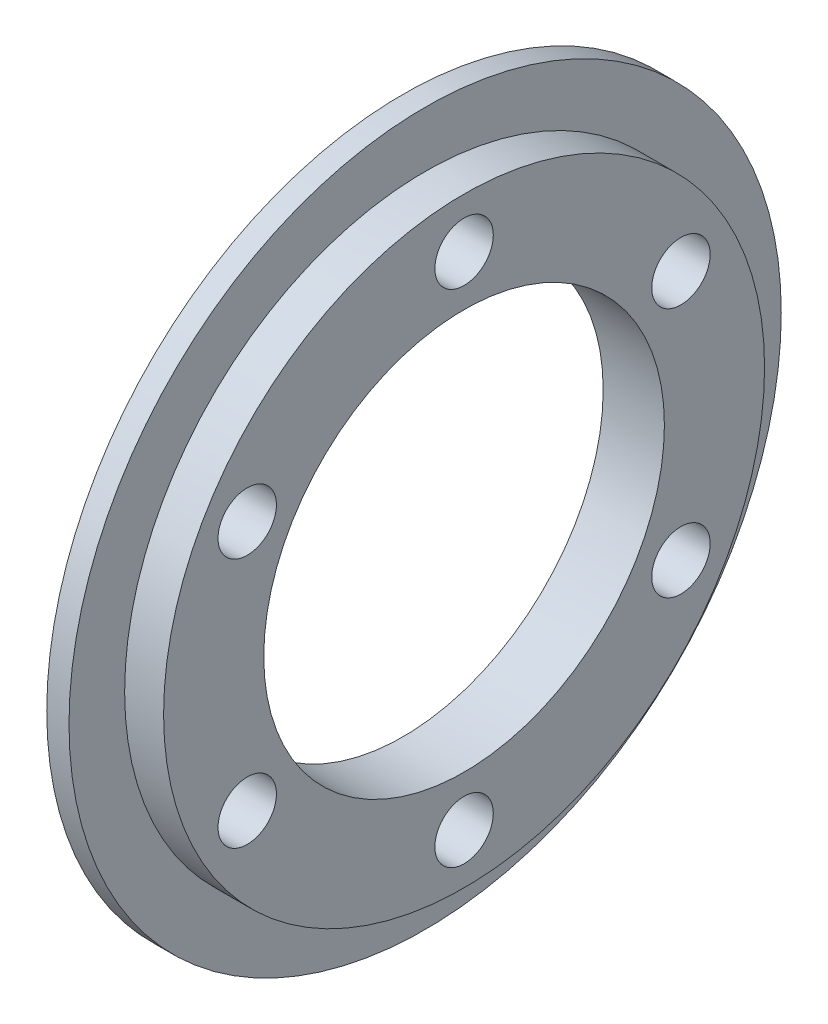
ISO-10303-21;
HEADER;
FILE_DESCRIPTION(('STEP AP214'),'2;1');
FILE_NAME('part.step','',(''),(''),'','','');
FILE_SCHEMA(('AUTOMOTIVE_DESIGN { 1 0 10303 214 1 1 1 1 }'));
ENDSEC;
DATA;
#1=APPLICATION_CONTEXT('core data for automotive mechanical design processes');
#2=APPLICATION_PROTOCOL_DEFINITION('international standard','automotive_design',2000,#1);
#3=PRODUCT_CONTEXT('',#1,'mechanical');
#4=PRODUCT('Part','Part','',(#3));
#5=PRODUCT_RELATED_PRODUCT_CATEGORY('part','',(#4));
#6=PRODUCT_DEFINITION_FORMATION('','',#4);
#7=PRODUCT_DEFINITION_CONTEXT('part definition',#1,'design');
#8=PRODUCT_DEFINITION('design','',#6,#7);
#9=PRODUCT_DEFINITION_SHAPE('','',#8);
#10=(LENGTH_UNIT() NAMED_UNIT(*) SI_UNIT(.MILLI.,.METRE.));
#11=(NAMED_UNIT(*) PLANE_ANGLE_UNIT() SI_UNIT($,.RADIAN.));
#12=(NAMED_UNIT(*) SI_UNIT($,.STERADIAN.) SOLID_ANGLE_UNIT());
#13=UNCERTAINTY_MEASURE_WITH_UNIT(LENGTH_MEASURE(1.E-05),#10,'distance_accuracy_value','');
#14=(GEOMETRIC_REPRESENTATION_CONTEXT(3) GLOBAL_UNCERTAINTY_ASSIGNED_CONTEXT((#13)) GLOBAL_UNIT_ASSIGNED_CONTEXT((#10,
#11,#12)) REPRESENTATION_CONTEXT('',''));
#15=CARTESIAN_POINT('',(0.,0.,0.));
#16=DIRECTION('',(0.,0.,1.));
#17=DIRECTION('',(1.,0.,0.));
#18=AXIS2_PLACEMENT_3D('',#15,#16,#17);
#19=CARTESIAN_POINT('',(-0.499999999999622,0.,-3.70187199858681E-12));
#20=DIRECTION('',(-1.,0.,-2.1153554277646E-13));
#21=DIRECTION('',(-2.1153554277646E-13,0.,1.));
#22=AXIS2_PLACEMENT_3D('',#19,#20,#21);
#23=CYLINDRICAL_SURFACE('',#22,35.999999999997);
#24=CARTESIAN_POINT('',(10.9999999999924,0.,-1.2692132566592E-12));
#25=DIRECTION('',(-1.,0.,-2.1153554277646E-13));
#26=DIRECTION('',(-2.1153554277646E-13,0.,1.));
#27=AXIS2_PLACEMENT_3D('',#24,#25,#26);
#28=CIRCLE('',#27,35.9999999999981);
#29=CARTESIAN_POINT('',(10.9999999999848,0.,35.9999999999969));
#30=VERTEX_POINT('',#29);
#31=EDGE_CURVE('E10',#30,#30,#28,.T.);
#32=ORIENTED_EDGE('',*,*,#31,.F.);
#33=EDGE_LOOP('',(#32));
#34=FACE_BOUND('',#33,.T.);
#35=CARTESIAN_POINT('',(-7.61185819236898E-12,0.,-3.59610422720027E-12));
#36=DIRECTION('',(-1.,0.,-2.1153554277646E-13));
#37=DIRECTION('',(-2.1153554277646E-13,0.,1.));
#38=AXIS2_PLACEMENT_3D('',#35,#36,#37);
#39=CIRCLE('',#38,35.9999999999958);
#40=CARTESIAN_POINT('',(-1.52271377323207E-11,0.,35.9999999999922));
#41=VERTEX_POINT('',#40);
#42=EDGE_CURVE('E61',#41,#41,#39,.T.);
#43=ORIENTED_EDGE('',*,*,#42,.T.);
#44=EDGE_LOOP('',(#43));
#45=FACE_BOUND('',#44,.T.);
#46=ADVANCED_FACE('F39',(#34,#45),#23,.F.);
#47=CARTESIAN_POINT('',(10.9999999999981,0.,-35.9999999999994));
#48=DIRECTION('',(-1.,0.,-2.1153554277646E-13));
#49=DIRECTION('',(-2.1153554277646E-13,0.,1.));
#50=AXIS2_PLACEMENT_3D('',#47,#48,#49);
#51=PLANE('',#50);
#52=CARTESIAN_POINT('',(10.9999999999905,45.0000000000002,2.32689097053905E-12));
#53=DIRECTION('',(1.,0.,1.34460344093496E-13));
#54=DIRECTION('',(1.34460344093496E-13,0.,-1.));
#55=AXIS2_PLACEMENT_3D('',#52,#53,#54);
#56=CIRCLE('',#55,5.25);
#57=CARTESIAN_POINT('',(10.9999999999912,45.0000000000002,-5.24999999999767));
#58=VERTEX_POINT('',#57);
#59=EDGE_CURVE('E97',#58,#58,#56,.T.);
#60=ORIENTED_EDGE('',*,*,#59,.F.);
#61=EDGE_LOOP('',(#60));
#62=FACE_BOUND('',#61,.T.);
#63=CARTESIAN_POINT('',(10.9999999999957,22.4999999999926,-38.9711431702931));
#64=DIRECTION('',(1.,0.,1.34460344093496E-13));
#65=DIRECTION('',(1.34460344093496E-13,0.,-1.));
#66=AXIS2_PLACEMENT_3D('',#63,#64,#65);
#67=CIRCLE('',#66,5.25);
#68=CARTESIAN_POINT('',(10.9999999999964,22.4999999999926,-44.2211431702931));
#69=VERTEX_POINT('',#68);
#70=EDGE_CURVE('E91',#69,#69,#67,.T.);
#71=ORIENTED_EDGE('',*,*,#70,.F.);
#72=EDGE_LOOP('',(#71));
#73=FACE_BOUND('',#72,.T.);
#74=CARTESIAN_POINT('',(10.9999999999957,-22.5000000000076,-38.9711431702844));
#75=DIRECTION('',(1.,0.,1.34460344093496E-13));
#76=DIRECTION('',(1.34460344093496E-13,0.,-1.));
#77=AXIS2_PLACEMENT_3D('',#74,#75,#76);
#78=CIRCLE('',#77,5.25);
#79=CARTESIAN_POINT('',(10.9999999999964,-22.5000000000076,-44.2211431702844));
#80=VERTEX_POINT('',#79);
#81=EDGE_CURVE('E85',#80,#80,#78,.T.);
#82=ORIENTED_EDGE('',*,*,#81,.F.);
#83=EDGE_LOOP('',(#82));
#84=FACE_BOUND('',#83,.T.);
#85=CARTESIAN_POINT('',(10.9999999999905,-45.,1.98832304406973E-11));
#86=DIRECTION('',(1.,0.,1.34460344093496E-13));
#87=DIRECTION('',(1.34460344093496E-13,0.,-1.));
#88=AXIS2_PLACEMENT_3D('',#85,#86,#87);
#89=CIRCLE('',#88,5.25);
#90=CARTESIAN_POINT('',(10.9999999999912,-45.,-5.24999999998011));
#91=VERTEX_POINT('',#90);
#92=EDGE_CURVE('E79',#91,#91,#89,.T.);
#93=ORIENTED_EDGE('',*,*,#92,.F.);
#94=EDGE_LOOP('',(#93));
#95=FACE_BOUND('',#94,.T.);
#96=CARTESIAN_POINT('',(10.9999999999852,-22.4999999999924,38.9711431703153));
#97=DIRECTION('',(1.,0.,1.34460344093496E-13));
#98=DIRECTION('',(1.34460344093496E-13,0.,-1.));
#99=AXIS2_PLACEMENT_3D('',#96,#97,#98);
#100=CIRCLE('',#99,5.25);
#101=CARTESIAN_POINT('',(10.9999999999859,-22.4999999999924,33.7211431703153));
#102=VERTEX_POINT('',#101);
#103=EDGE_CURVE('E73',#102,#102,#100,.T.);
#104=ORIENTED_EDGE('',*,*,#103,.F.);
#105=EDGE_LOOP('',(#104));
#106=FACE_BOUND('',#105,.T.);
#107=CARTESIAN_POINT('',(10.9999999999852,22.5000000000078,38.9711431703066));
#108=DIRECTION('',(1.,0.,1.34460344093496E-13));
#109=DIRECTION('',(1.34460344093496E-13,0.,-1.));
#110=AXIS2_PLACEMENT_3D('',#107,#108,#109);
#111=CIRCLE('',#110,5.25);
#112=CARTESIAN_POINT('',(10.9999999999859,22.5000000000078,33.7211431703066));
#113=VERTEX_POINT('',#112);
#114=EDGE_CURVE('E67',#113,#113,#111,.T.);
#115=ORIENTED_EDGE('',*,*,#114,.F.);
#116=EDGE_LOOP('',(#115));
#117=FACE_BOUND('',#116,.T.);
#118=CARTESIAN_POINT('',(10.9999999999886,0.,-1.26921325666001E-12));
#119=DIRECTION('',(-1.,0.,-2.1153554277646E-13));
#120=DIRECTION('',(-2.1153554277646E-13,0.,1.));
#121=AXIS2_PLACEMENT_3D('',#118,#119,#120);
#122=CIRCLE('',#121,53.9999999999981);
#123=CARTESIAN_POINT('',(10.9999999999772,0.,53.9999999999969));
#124=VERTEX_POINT('',#123);
#125=EDGE_CURVE('E45',#124,#124,#122,.T.);
#126=ORIENTED_EDGE('',*,*,#125,.F.);
#127=EDGE_LOOP('',(#126));
#128=FACE_BOUND('',#127,.T.);
#129=ORIENTED_EDGE('',*,*,#31,.T.);
#130=EDGE_LOOP('',(#129));
#131=FACE_BOUND('',#130,.T.);
#132=ADVANCED_FACE('F103',(#62,#73,#84,#95,#106,#117,#128,#131),#51,.F.);
#133=CARTESIAN_POINT('',(-0.499999999999622,0.,-3.70187199858681E-12));
#134=DIRECTION('',(-1.,0.,-2.1153554277646E-13));
#135=DIRECTION('',(-2.1153554277646E-13,0.,1.));
#136=AXIS2_PLACEMENT_3D('',#133,#134,#135);
#137=CYLINDRICAL_SURFACE('',#136,53.9999999999974);
#138=CARTESIAN_POINT('',(3.99999999998858,0.,-2.74996205609523E-12));
#139=DIRECTION('',(-1.,0.,-2.1153554277646E-13));
#140=DIRECTION('',(-2.1153554277646E-13,0.,1.));
#141=AXIS2_PLACEMENT_3D('',#138,#139,#140);
#142=CIRCLE('',#141,53.9999999999966);
#143=CARTESIAN_POINT('',(3.99999999997716,0.,53.9999999999939));
#144=VERTEX_POINT('',#143);
#145=EDGE_CURVE('E49',#144,#144,#142,.T.);
#146=ORIENTED_EDGE('',*,*,#145,.F.);
#147=EDGE_LOOP('',(#146));
#148=FACE_BOUND('',#147,.T.);
#149=ORIENTED_EDGE('',*,*,#125,.T.);
#150=EDGE_LOOP('',(#149));
#151=FACE_BOUND('',#150,.T.);
#152=ADVANCED_FACE('F106',(#148,#151),#137,.T.);
#153=CARTESIAN_POINT('',(3.99999999999894,0.,-53.9999999999994));
#154=DIRECTION('',(-1.,0.,-2.1153554277646E-13));
#155=DIRECTION('',(-2.1153554277646E-13,0.,1.));
#156=AXIS2_PLACEMENT_3D('',#153,#154,#155);
#157=PLANE('',#156);
#158=CARTESIAN_POINT('',(3.99999999998646,0.,-2.74996205609568E-12));
#159=DIRECTION('',(-1.,0.,-2.1153554277646E-13));
#160=DIRECTION('',(-2.1153554277646E-13,0.,1.));
#161=AXIS2_PLACEMENT_3D('',#158,#159,#160);
#162=CIRCLE('',#161,63.9999999999966);
#163=CARTESIAN_POINT('',(3.99999999997292,0.,63.9999999999939));
#164=VERTEX_POINT('',#163);
#165=EDGE_CURVE('E53',#164,#164,#162,.T.);
#166=ORIENTED_EDGE('',*,*,#165,.F.);
#167=EDGE_LOOP('',(#166));
#168=FACE_BOUND('',#167,.T.);
#169=ORIENTED_EDGE('',*,*,#145,.T.);
#170=EDGE_LOOP('',(#169));
#171=FACE_BOUND('',#170,.T.);
#172=ADVANCED_FACE('F148',(#168,#171),#157,.F.);
#173=CARTESIAN_POINT('',(-0.499999999999622,0.,-3.70187199858681E-12));
#174=DIRECTION('',(-1.,0.,-2.1153554277646E-13));
#175=DIRECTION('',(-2.1153554277646E-13,0.,1.));
#176=AXIS2_PLACEMENT_3D('',#173,#174,#175);
#177=CYLINDRICAL_SURFACE('',#176,63.9999999999962);
#178=CARTESIAN_POINT('',(-1.35365893841333E-11,0.,-3.59610422720152E-12));
#179=DIRECTION('',(-1.,0.,-2.1153554277646E-13));
#180=DIRECTION('',(-2.1153554277646E-13,0.,1.));
#181=AXIS2_PLACEMENT_3D('',#178,#179,#180);
#182=CIRCLE('',#181,63.9999999999958);
#183=CARTESIAN_POINT('',(-2.70748641218258E-11,0.,63.9999999999922));
#184=VERTEX_POINT('',#183);
#185=EDGE_CURVE('E58',#184,#184,#182,.T.);
#186=ORIENTED_EDGE('',*,*,#185,.F.);
#187=EDGE_LOOP('',(#186));
#188=FACE_BOUND('',#187,.T.);
#189=ORIENTED_EDGE('',*,*,#165,.T.);
#190=EDGE_LOOP('',(#189));
#191=FACE_BOUND('',#190,.T.);
#192=ADVANCED_FACE('F131',(#188,#191),#177,.T.);
#193=CARTESIAN_POINT('',(1.90630929705409E-12,0.,-53.9999999999994));
#194=DIRECTION('',(1.,0.,2.1153554277646E-13));
#195=DIRECTION('',(2.1153554277646E-13,0.,-1.));
#196=AXIS2_PLACEMENT_3D('',#193,#194,#195);
#197=PLANE('',#196);
#198=CARTESIAN_POINT('',(-3.56815271773669E-11,45.0000000000002,8.47827185507079E-13));
#199=DIRECTION('',(1.,0.,1.34460344093496E-13));
#200=DIRECTION('',(1.34460344093496E-13,0.,-1.));
#201=AXIS2_PLACEMENT_3D('',#198,#199,#200);
#202=CIRCLE('',#201,5.25);
#203=CARTESIAN_POINT('',(-3.49756103708761E-11,45.0000000000002,-5.24999999999915));
#204=VERTEX_POINT('',#203);
#205=EDGE_CURVE('E94',#204,#204,#202,.T.);
#206=ORIENTED_EDGE('',*,*,#205,.T.);
#207=EDGE_LOOP('',(#206));
#208=FACE_BOUND('',#207,.T.);
#209=CARTESIAN_POINT('',(-3.0440927556441E-11,22.4999999999926,-38.9711431702946));
#210=DIRECTION('',(1.,0.,1.34460344093496E-13));
#211=DIRECTION('',(1.34460344093496E-13,0.,-1.));
#212=AXIS2_PLACEMENT_3D('',#209,#210,#211);
#213=CIRCLE('',#212,5.25);
#214=CARTESIAN_POINT('',(-2.97350107499502E-11,22.4999999999926,-44.2211431702946));
#215=VERTEX_POINT('',#214);
#216=EDGE_CURVE('E88',#215,#215,#213,.T.);
#217=ORIENTED_EDGE('',*,*,#216,.T.);
#218=EDGE_LOOP('',(#217));
#219=FACE_BOUND('',#218,.T.);
#220=CARTESIAN_POINT('',(-3.0440927556441E-11,-22.5000000000076,-38.9711431702858));
#221=DIRECTION('',(1.,0.,1.34460344093496E-13));
#222=DIRECTION('',(1.34460344093496E-13,0.,-1.));
#223=AXIS2_PLACEMENT_3D('',#220,#221,#222);
#224=CIRCLE('',#223,5.25);
#225=CARTESIAN_POINT('',(-2.97350107499502E-11,-22.5000000000076,-44.2211431702858));
#226=VERTEX_POINT('',#225);
#227=EDGE_CURVE('E82',#226,#226,#224,.T.);
#228=ORIENTED_EDGE('',*,*,#227,.T.);
#229=EDGE_LOOP('',(#228));
#230=FACE_BOUND('',#229,.T.);
#231=CARTESIAN_POINT('',(-3.56815271773669E-11,-45.,1.84041666556653E-11));
#232=DIRECTION('',(1.,0.,1.34460344093496E-13));
#233=DIRECTION('',(1.34460344093496E-13,0.,-1.));
#234=AXIS2_PLACEMENT_3D('',#231,#232,#233);
#235=CIRCLE('',#234,5.25);
#236=CARTESIAN_POINT('',(-3.49756103708761E-11,-45.,-5.24999999998159));
#237=VERTEX_POINT('',#236);
#238=EDGE_CURVE('E76',#237,#237,#235,.T.);
#239=ORIENTED_EDGE('',*,*,#238,.T.);
#240=EDGE_LOOP('',(#239));
#241=FACE_BOUND('',#240,.T.);
#242=CARTESIAN_POINT('',(-4.09221267982929E-11,-22.4999999999924,38.9711431703138));
#243=DIRECTION('',(1.,0.,1.34460344093496E-13));
#244=DIRECTION('',(1.34460344093496E-13,0.,-1.));
#245=AXIS2_PLACEMENT_3D('',#242,#243,#244);
#246=CIRCLE('',#245,5.25);
#247=CARTESIAN_POINT('',(-4.0216209991802E-11,-22.4999999999924,33.7211431703139));
#248=VERTEX_POINT('',#247);
#249=EDGE_CURVE('E70',#248,#248,#246,.T.);
#250=ORIENTED_EDGE('',*,*,#249,.T.);
#251=EDGE_LOOP('',(#250));
#252=FACE_BOUND('',#251,.T.);
#253=CARTESIAN_POINT('',(-4.09221267982929E-11,22.5000000000078,38.9711431703051));
#254=DIRECTION('',(1.,0.,1.34460344093496E-13));
#255=DIRECTION('',(1.34460344093496E-13,0.,-1.));
#256=AXIS2_PLACEMENT_3D('',#253,#254,#255);
#257=CIRCLE('',#256,5.25);
#258=CARTESIAN_POINT('',(-4.0216209991802E-11,22.5000000000078,33.7211431703051));
#259=VERTEX_POINT('',#258);
#260=EDGE_CURVE('E64',#259,#259,#257,.T.);
#261=ORIENTED_EDGE('',*,*,#260,.T.);
#262=EDGE_LOOP('',(#261));
#263=FACE_BOUND('',#262,.T.);
#264=ORIENTED_EDGE('',*,*,#42,.F.);
#265=EDGE_LOOP('',(#264));
#266=FACE_BOUND('',#265,.T.);
#267=ORIENTED_EDGE('',*,*,#185,.T.);
#268=EDGE_LOOP('',(#267));
#269=FACE_BOUND('',#268,.T.);
#270=ADVANCED_FACE('F121',(#208,#219,#230,#241,#252,#263,#266,#269),#197,.F.);
#271=CARTESIAN_POINT('',(10.9999999999852,22.5000000000078,38.9711431703066));
#272=DIRECTION('',(1.,0.,1.34460344093496E-13));
#273=DIRECTION('',(1.34460344093496E-13,0.,-1.));
#274=AXIS2_PLACEMENT_3D('',#271,#272,#273);
#275=CYLINDRICAL_SURFACE('',#274,5.25);
#276=ORIENTED_EDGE('',*,*,#260,.F.);
#277=EDGE_LOOP('',(#276));
#278=FACE_BOUND('',#277,.T.);
#279=ORIENTED_EDGE('',*,*,#114,.T.);
#280=EDGE_LOOP('',(#279));
#281=FACE_BOUND('',#280,.T.);
#282=ADVANCED_FACE('F118',(#278,#281),#275,.F.);
#283=CARTESIAN_POINT('',(10.9999999999852,-22.4999999999924,38.9711431703153));
#284=DIRECTION('',(1.,0.,1.34460344093496E-13));
#285=DIRECTION('',(1.34460344093496E-13,0.,-1.));
#286=AXIS2_PLACEMENT_3D('',#283,#284,#285);
#287=CYLINDRICAL_SURFACE('',#286,5.25);
#288=ORIENTED_EDGE('',*,*,#249,.F.);
#289=EDGE_LOOP('',(#288));
#290=FACE_BOUND('',#289,.T.);
#291=ORIENTED_EDGE('',*,*,#103,.T.);
#292=EDGE_LOOP('',(#291));
#293=FACE_BOUND('',#292,.T.);
#294=ADVANCED_FACE('F120',(#290,#293),#287,.F.);
#295=CARTESIAN_POINT('',(10.9999999999905,-45.,1.98832304406973E-11));
#296=DIRECTION('',(1.,0.,1.34460344093496E-13));
#297=DIRECTION('',(1.34460344093496E-13,0.,-1.));
#298=AXIS2_PLACEMENT_3D('',#295,#296,#297);
#299=CYLINDRICAL_SURFACE('',#298,5.25);
#300=ORIENTED_EDGE('',*,*,#238,.F.);
#301=EDGE_LOOP('',(#300));
#302=FACE_BOUND('',#301,.T.);
#303=ORIENTED_EDGE('',*,*,#92,.T.);
#304=EDGE_LOOP('',(#303));
#305=FACE_BOUND('',#304,.T.);
#306=ADVANCED_FACE('F128',(#302,#305),#299,.F.);
#307=CARTESIAN_POINT('',(10.9999999999957,-22.5000000000076,-38.9711431702844));
#308=DIRECTION('',(1.,0.,1.34460344093496E-13));
#309=DIRECTION('',(1.34460344093496E-13,0.,-1.));
#310=AXIS2_PLACEMENT_3D('',#307,#308,#309);
#311=CYLINDRICAL_SURFACE('',#310,5.25);
#312=ORIENTED_EDGE('',*,*,#227,.F.);
#313=EDGE_LOOP('',(#312));
#314=FACE_BOUND('',#313,.T.);
#315=ORIENTED_EDGE('',*,*,#81,.T.);
#316=EDGE_LOOP('',(#315));
#317=FACE_BOUND('',#316,.T.);
#318=ADVANCED_FACE('F202',(#314,#317),#311,.F.);
#319=CARTESIAN_POINT('',(10.9999999999957,22.4999999999926,-38.9711431702931));
#320=DIRECTION('',(1.,0.,1.34460344093496E-13));
#321=DIRECTION('',(1.34460344093496E-13,0.,-1.));
#322=AXIS2_PLACEMENT_3D('',#319,#320,#321);
#323=CYLINDRICAL_SURFACE('',#322,5.25);
#324=ORIENTED_EDGE('',*,*,#216,.F.);
#325=EDGE_LOOP('',(#324));
#326=FACE_BOUND('',#325,.T.);
#327=ORIENTED_EDGE('',*,*,#70,.T.);
#328=EDGE_LOOP('',(#327));
#329=FACE_BOUND('',#328,.T.);
#330=ADVANCED_FACE('F212',(#326,#329),#323,.F.);
#331=CARTESIAN_POINT('',(10.9999999999905,45.0000000000002,2.32689097053905E-12));
#332=DIRECTION('',(1.,0.,1.34460344093496E-13));
#333=DIRECTION('',(1.34460344093496E-13,0.,-1.));
#334=AXIS2_PLACEMENT_3D('',#331,#332,#333);
#335=CYLINDRICAL_SURFACE('',#334,5.25);
#336=ORIENTED_EDGE('',*,*,#205,.F.);
#337=EDGE_LOOP('',(#336));
#338=FACE_BOUND('',#337,.T.);
#339=ORIENTED_EDGE('',*,*,#59,.T.);
#340=EDGE_LOOP('',(#339));
#341=FACE_BOUND('',#340,.T.);
#342=ADVANCED_FACE('F101',(#338,#341),#335,.F.);
#343=CLOSED_SHELL('',(#46,#132,#152,#172,#192,#270,#282,#294,#306,#318,#330,#342));
#344=MANIFOLD_SOLID_BREP('B2',#343);
#345=ADVANCED_BREP_SHAPE_REPRESENTATION('',(#18,#344),#14);
#346=SHAPE_DEFINITION_REPRESENTATION(#9,#345);
ENDSEC;
END-ISO-10303-21;
